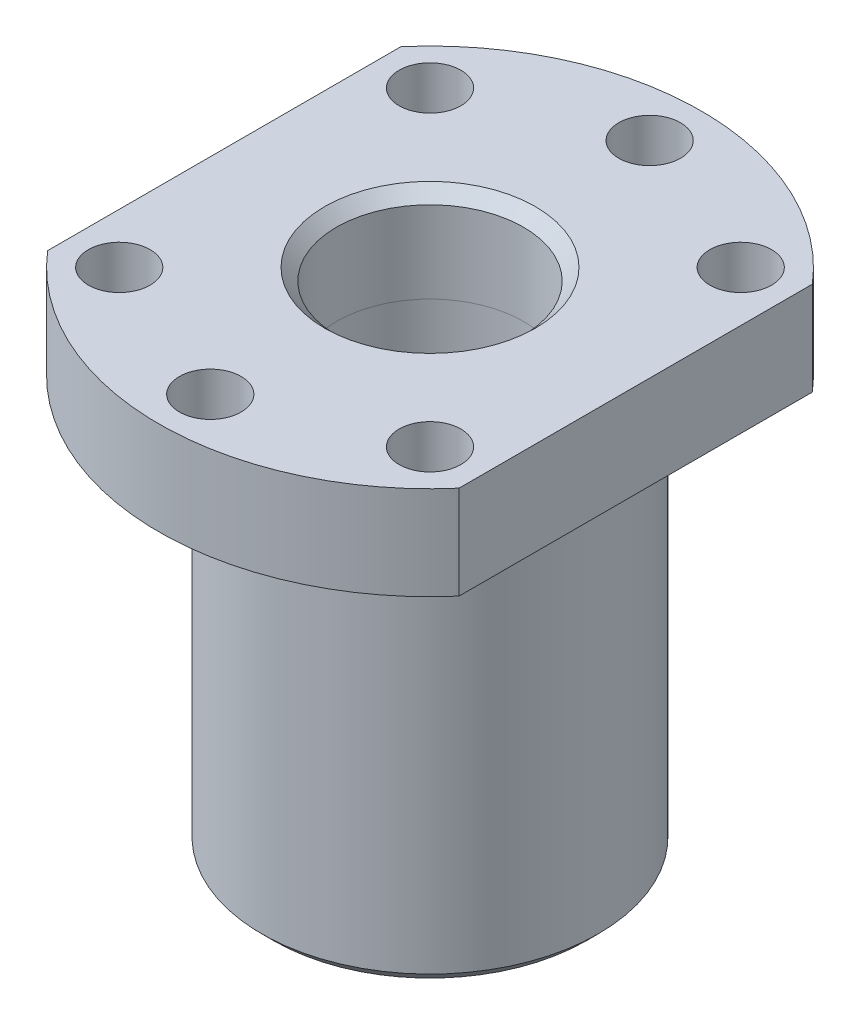
ISO-10303-21;
HEADER;
FILE_DESCRIPTION(('STEP AP214'),'2;1');
FILE_NAME('part.step','',(''),(''),'','','');
FILE_SCHEMA(('AUTOMOTIVE_DESIGN { 1 0 10303 214 1 1 1 1 }'));
ENDSEC;
DATA;
#1=APPLICATION_CONTEXT('core data for automotive mechanical design processes');
#2=APPLICATION_PROTOCOL_DEFINITION('international standard','automotive_design',2000,#1);
#3=PRODUCT_CONTEXT('',#1,'mechanical');
#4=PRODUCT('Part','Part','',(#3));
#5=PRODUCT_RELATED_PRODUCT_CATEGORY('part','',(#4));
#6=PRODUCT_DEFINITION_FORMATION('','',#4);
#7=PRODUCT_DEFINITION_CONTEXT('part definition',#1,'design');
#8=PRODUCT_DEFINITION('design','',#6,#7);
#9=PRODUCT_DEFINITION_SHAPE('','',#8);
#10=(LENGTH_UNIT() NAMED_UNIT(*) SI_UNIT(.MILLI.,.METRE.));
#11=(NAMED_UNIT(*) PLANE_ANGLE_UNIT() SI_UNIT($,.RADIAN.));
#12=(NAMED_UNIT(*) SI_UNIT($,.STERADIAN.) SOLID_ANGLE_UNIT());
#13=UNCERTAINTY_MEASURE_WITH_UNIT(LENGTH_MEASURE(1.E-05),#10,'distance_accuracy_value','');
#14=(GEOMETRIC_REPRESENTATION_CONTEXT(3) GLOBAL_UNCERTAINTY_ASSIGNED_CONTEXT((#13)) GLOBAL_UNIT_ASSIGNED_CONTEXT((#10,
#11,#12)) REPRESENTATION_CONTEXT('',''));
#15=CARTESIAN_POINT('',(0.,0.,0.));
#16=DIRECTION('',(0.,0.,1.));
#17=DIRECTION('',(1.,0.,0.));
#18=AXIS2_PLACEMENT_3D('',#15,#16,#17);
#19=CARTESIAN_POINT('',(0.,0.,0.));
#20=DIRECTION('',(0.,1.,0.));
#21=DIRECTION('',(1.,0.,0.));
#22=AXIS2_PLACEMENT_3D('',#19,#20,#21);
#23=PLANE('',#22);
#24=CARTESIAN_POINT('',(16.6170093578839,0.,16.6170093578839));
#25=DIRECTION('',(0.,-1.,0.));
#26=DIRECTION('',(1.,0.,0.));
#27=AXIS2_PLACEMENT_3D('',#24,#25,#26);
#28=CIRCLE('',#27,3.3);
#29=CARTESIAN_POINT('',(13.3170093578839,0.,16.6170093578839));
#30=VERTEX_POINT('',#29);
#31=EDGE_CURVE('P0_E194',#30,#30,#28,.T.);
#32=ORIENTED_EDGE('',*,*,#31,.F.);
#33=EDGE_LOOP('',(#32));
#34=FACE_BOUND('',#33,.T.);
#35=CARTESIAN_POINT('',(-16.6170093578839,0.,16.6170093578839));
#36=DIRECTION('',(0.,-1.,0.));
#37=DIRECTION('',(1.,0.,0.));
#38=AXIS2_PLACEMENT_3D('',#35,#36,#37);
#39=CIRCLE('',#38,3.3);
#40=CARTESIAN_POINT('',(-19.9170093578839,0.,16.6170093578839));
#41=VERTEX_POINT('',#40);
#42=EDGE_CURVE('P0_E205',#41,#41,#39,.T.);
#43=ORIENTED_EDGE('',*,*,#42,.F.);
#44=EDGE_LOOP('',(#43));
#45=FACE_BOUND('',#44,.T.);
#46=CARTESIAN_POINT('',(0.,0.,0.));
#47=DIRECTION('',(0.,-1.,0.));
#48=DIRECTION('',(1.,0.,0.));
#49=AXIS2_PLACEMENT_3D('',#46,#47,#48);
#50=CIRCLE('',#49,10.);
#51=CARTESIAN_POINT('',(-10.,0.,0.));
#52=VERTEX_POINT('',#51);
#53=EDGE_CURVE('P0_E156',#52,#52,#50,.T.);
#54=ORIENTED_EDGE('',*,*,#53,.F.);
#55=EDGE_LOOP('',(#54));
#56=FACE_BOUND('',#55,.T.);
#57=CARTESIAN_POINT('',(16.6170093578839,0.,-16.6170093578839));
#58=DIRECTION('',(0.,-1.,0.));
#59=DIRECTION('',(1.,0.,0.));
#60=AXIS2_PLACEMENT_3D('',#57,#58,#59);
#61=CIRCLE('',#60,3.3);
#62=CARTESIAN_POINT('',(13.3170093578839,0.,-16.6170093578839));
#63=VERTEX_POINT('',#62);
#64=EDGE_CURVE('P0_E207',#63,#63,#61,.T.);
#65=ORIENTED_EDGE('',*,*,#64,.F.);
#66=EDGE_LOOP('',(#65));
#67=FACE_BOUND('',#66,.T.);
#68=CARTESIAN_POINT('',(-16.6170093578839,0.,-16.6170093578839));
#69=DIRECTION('',(0.,-1.,0.));
#70=DIRECTION('',(1.,0.,0.));
#71=AXIS2_PLACEMENT_3D('',#68,#69,#70);
#72=CIRCLE('',#71,3.3);
#73=CARTESIAN_POINT('',(-19.9170093578839,0.,-16.6170093578839));
#74=VERTEX_POINT('',#73);
#75=EDGE_CURVE('P0_E216',#74,#74,#72,.T.);
#76=ORIENTED_EDGE('',*,*,#75,.F.);
#77=EDGE_LOOP('',(#76));
#78=FACE_BOUND('',#77,.T.);
#79=CARTESIAN_POINT('',(0.,0.,23.5));
#80=DIRECTION('',(0.,-1.,0.));
#81=DIRECTION('',(1.,0.,0.));
#82=AXIS2_PLACEMENT_3D('',#79,#80,#81);
#83=CIRCLE('',#82,3.3);
#84=CARTESIAN_POINT('',(-3.3,0.,23.5));
#85=VERTEX_POINT('',#84);
#86=EDGE_CURVE('P0_E225',#85,#85,#83,.T.);
#87=ORIENTED_EDGE('',*,*,#86,.F.);
#88=EDGE_LOOP('',(#87));
#89=FACE_BOUND('',#88,.T.);
#90=CARTESIAN_POINT('',(-0.00892580224964604,0.,-23.4999983048947));
#91=DIRECTION('',(0.,-1.,0.));
#92=DIRECTION('',(1.,0.,0.));
#93=AXIS2_PLACEMENT_3D('',#90,#91,#92);
#94=CIRCLE('',#93,3.3);
#95=CARTESIAN_POINT('',(-3.30892580224965,0.,-23.4999983048947));
#96=VERTEX_POINT('',#95);
#97=EDGE_CURVE('P0_E121',#96,#96,#94,.T.);
#98=ORIENTED_EDGE('',*,*,#97,.F.);
#99=EDGE_LOOP('',(#98));
#100=FACE_BOUND('',#99,.T.);
#101=CARTESIAN_POINT('',(0.,0.,0.));
#102=DIRECTION('',(0.,1.,0.));
#103=DIRECTION('',(1.,0.,0.));
#104=AXIS2_PLACEMENT_3D('',#101,#102,#103);
#105=CIRCLE('',#104,29.);
#106=CARTESIAN_POINT('',(-22.,0.,18.8944436276912));
#107=VERTEX_POINT('',#106);
#108=CARTESIAN_POINT('',(22.,0.,18.8944436276912));
#109=VERTEX_POINT('',#108);
#110=EDGE_CURVE('P0_E11',#107,#109,#105,.T.);
#111=ORIENTED_EDGE('',*,*,#110,.F.);
#112=DIRECTION('',(0.,0.,-1.));
#113=VECTOR('',#112,1.);
#114=CARTESIAN_POINT('',(-22.,0.,18.8944436276912));
#115=LINE('',#114,#113);
#116=CARTESIAN_POINT('',(-22.,0.,-18.8944436276912));
#117=VERTEX_POINT('',#116);
#118=EDGE_CURVE('P0_E102',#107,#117,#115,.T.);
#119=ORIENTED_EDGE('',*,*,#118,.T.);
#120=CARTESIAN_POINT('',(0.,0.,0.));
#121=DIRECTION('',(0.,1.,0.));
#122=DIRECTION('',(1.,0.,0.));
#123=AXIS2_PLACEMENT_3D('',#120,#121,#122);
#124=CIRCLE('',#123,29.);
#125=CARTESIAN_POINT('',(22.,0.,-18.8944436276912));
#126=VERTEX_POINT('',#125);
#127=EDGE_CURVE('P0_E131',#126,#117,#124,.T.);
#128=ORIENTED_EDGE('',*,*,#127,.F.);
#129=DIRECTION('',(0.,0.,1.));
#130=VECTOR('',#129,1.);
#131=CARTESIAN_POINT('',(22.,0.,-18.8944436276912));
#132=LINE('',#131,#130);
#133=EDGE_CURVE('P0_E47',#126,#109,#132,.T.);
#134=ORIENTED_EDGE('',*,*,#133,.T.);
#135=EDGE_LOOP('',(#111,#119,#128,#134));
#136=FACE_BOUND('',#135,.T.);
#137=ADVANCED_FACE('P0_F17',(#34,#45,#56,#67,#78,#89,#100,#136),#23,.F.);
#138=CARTESIAN_POINT('',(0.,0.,0.));
#139=DIRECTION('',(0.,1.,0.));
#140=DIRECTION('',(1.,0.,0.));
#141=AXIS2_PLACEMENT_3D('',#138,#139,#140);
#142=CYLINDRICAL_SURFACE('',#141,29.);
#143=ORIENTED_EDGE('',*,*,#110,.T.);
#144=DIRECTION('',(0.,1.,0.));
#145=VECTOR('',#144,1.);
#146=CARTESIAN_POINT('',(22.,0.,18.8944436276912));
#147=LINE('',#146,#145);
#148=CARTESIAN_POINT('',(22.,10.,18.8944436276912));
#149=VERTEX_POINT('',#148);
#150=EDGE_CURVE('P0_E21',#109,#149,#147,.T.);
#151=ORIENTED_EDGE('',*,*,#150,.T.);
#152=CARTESIAN_POINT('',(0.,10.,0.));
#153=DIRECTION('',(0.,1.,0.));
#154=DIRECTION('',(1.,0.,0.));
#155=AXIS2_PLACEMENT_3D('',#152,#153,#154);
#156=CIRCLE('',#155,29.);
#157=CARTESIAN_POINT('',(-22.,10.,18.8944436276912));
#158=VERTEX_POINT('',#157);
#159=EDGE_CURVE('P0_E112',#158,#149,#156,.T.);
#160=ORIENTED_EDGE('',*,*,#159,.F.);
#161=DIRECTION('',(0.,1.,0.));
#162=VECTOR('',#161,1.);
#163=CARTESIAN_POINT('',(-22.,0.,18.8944436276912));
#164=LINE('',#163,#162);
#165=EDGE_CURVE('P0_E110',#107,#158,#164,.T.);
#166=ORIENTED_EDGE('',*,*,#165,.F.);
#167=EDGE_LOOP('',(#143,#151,#160,#166));
#168=FACE_BOUND('',#167,.T.);
#169=ADVANCED_FACE('P0_F107',(#168),#142,.T.);
#170=CARTESIAN_POINT('',(22.,0.,18.8944436276912));
#171=DIRECTION('',(1.,0.,0.));
#172=DIRECTION('',(0.,1.,0.));
#173=AXIS2_PLACEMENT_3D('',#170,#171,#172);
#174=PLANE('',#173);
#175=ORIENTED_EDGE('',*,*,#133,.F.);
#176=DIRECTION('',(0.,1.,0.));
#177=VECTOR('',#176,1.);
#178=CARTESIAN_POINT('',(22.,0.,-18.8944436276912));
#179=LINE('',#178,#177);
#180=CARTESIAN_POINT('',(22.,10.,-18.8944436276912));
#181=VERTEX_POINT('',#180);
#182=EDGE_CURVE('P0_E133',#126,#181,#179,.T.);
#183=ORIENTED_EDGE('',*,*,#182,.T.);
#184=DIRECTION('',(0.,0.,-1.));
#185=VECTOR('',#184,1.);
#186=CARTESIAN_POINT('',(22.,10.,-18.8944436276912));
#187=LINE('',#186,#185);
#188=EDGE_CURVE('P0_E148',#149,#181,#187,.T.);
#189=ORIENTED_EDGE('',*,*,#188,.F.);
#190=ORIENTED_EDGE('',*,*,#150,.F.);
#191=EDGE_LOOP('',(#175,#183,#189,#190));
#192=FACE_BOUND('',#191,.T.);
#193=ADVANCED_FACE('P0_F19',(#192),#174,.T.);
#194=CARTESIAN_POINT('',(0.,0.,0.));
#195=DIRECTION('',(0.,1.,0.));
#196=DIRECTION('',(1.,0.,0.));
#197=AXIS2_PLACEMENT_3D('',#194,#195,#196);
#198=CYLINDRICAL_SURFACE('',#197,29.);
#199=ORIENTED_EDGE('',*,*,#127,.T.);
#200=DIRECTION('',(0.,1.,0.));
#201=VECTOR('',#200,1.);
#202=CARTESIAN_POINT('',(-22.,0.,-18.8944436276912));
#203=LINE('',#202,#201);
#204=CARTESIAN_POINT('',(-22.,10.,-18.8944436276912));
#205=VERTEX_POINT('',#204);
#206=EDGE_CURVE('P0_E116',#117,#205,#203,.T.);
#207=ORIENTED_EDGE('',*,*,#206,.T.);
#208=CARTESIAN_POINT('',(0.,10.,0.));
#209=DIRECTION('',(0.,1.,0.));
#210=DIRECTION('',(1.,0.,0.));
#211=AXIS2_PLACEMENT_3D('',#208,#209,#210);
#212=CIRCLE('',#211,29.);
#213=EDGE_CURVE('P0_E151',#181,#205,#212,.T.);
#214=ORIENTED_EDGE('',*,*,#213,.F.);
#215=ORIENTED_EDGE('',*,*,#182,.F.);
#216=EDGE_LOOP('',(#199,#207,#214,#215));
#217=FACE_BOUND('',#216,.T.);
#218=ADVANCED_FACE('P0_F335',(#217),#198,.T.);
#219=CARTESIAN_POINT('',(-22.,0.,-18.8944436276912));
#220=DIRECTION('',(-1.,0.,0.));
#221=DIRECTION('',(0.,1.,0.));
#222=AXIS2_PLACEMENT_3D('',#219,#220,#221);
#223=PLANE('',#222);
#224=ORIENTED_EDGE('',*,*,#118,.F.);
#225=ORIENTED_EDGE('',*,*,#165,.T.);
#226=DIRECTION('',(0.,0.,1.));
#227=VECTOR('',#226,1.);
#228=CARTESIAN_POINT('',(-22.,10.,18.8944436276912));
#229=LINE('',#228,#227);
#230=EDGE_CURVE('P0_E152',#205,#158,#229,.T.);
#231=ORIENTED_EDGE('',*,*,#230,.F.);
#232=ORIENTED_EDGE('',*,*,#206,.F.);
#233=EDGE_LOOP('',(#224,#225,#231,#232));
#234=FACE_BOUND('',#233,.T.);
#235=ADVANCED_FACE('P0_F118',(#234),#223,.T.);
#236=CARTESIAN_POINT('',(-0.00892580224964604,0.,-23.4999983048947));
#237=DIRECTION('',(0.,1.,0.));
#238=DIRECTION('',(1.,0.,0.));
#239=AXIS2_PLACEMENT_3D('',#236,#237,#238);
#240=CYLINDRICAL_SURFACE('',#239,3.3);
#241=CARTESIAN_POINT('',(-0.00892580224964604,10.,-23.4999983048947));
#242=DIRECTION('',(0.,-1.,0.));
#243=DIRECTION('',(1.,0.,0.));
#244=AXIS2_PLACEMENT_3D('',#241,#242,#243);
#245=CIRCLE('',#244,3.3);
#246=CARTESIAN_POINT('',(-3.30892580224965,10.,-23.4999983048947));
#247=VERTEX_POINT('',#246);
#248=EDGE_CURVE('P0_E182',#247,#247,#245,.T.);
#249=ORIENTED_EDGE('',*,*,#248,.F.);
#250=DIRECTION('',(0.,-1.,0.));
#251=VECTOR('',#250,1.);
#252=CARTESIAN_POINT('',(-3.30892580224965,0.,-23.4999983048947));
#253=LINE('',#252,#251);
#254=EDGE_CURVE('P0_E126',#247,#96,#253,.T.);
#255=ORIENTED_EDGE('',*,*,#254,.T.);
#256=ORIENTED_EDGE('',*,*,#97,.T.);
#257=ORIENTED_EDGE('',*,*,#254,.F.);
#258=EDGE_LOOP('',(#249,#255,#256,#257));
#259=FACE_BOUND('',#258,.T.);
#260=ADVANCED_FACE('P0_F231',(#259),#240,.F.);
#261=CARTESIAN_POINT('',(0.,0.,23.5));
#262=DIRECTION('',(0.,1.,0.));
#263=DIRECTION('',(1.,0.,0.));
#264=AXIS2_PLACEMENT_3D('',#261,#262,#263);
#265=CYLINDRICAL_SURFACE('',#264,3.3);
#266=CARTESIAN_POINT('',(0.,10.,23.5));
#267=DIRECTION('',(0.,-1.,0.));
#268=DIRECTION('',(1.,0.,0.));
#269=AXIS2_PLACEMENT_3D('',#266,#267,#268);
#270=CIRCLE('',#269,3.3);
#271=CARTESIAN_POINT('',(-3.3,10.,23.5));
#272=VERTEX_POINT('',#271);
#273=EDGE_CURVE('P0_E183',#272,#272,#270,.T.);
#274=ORIENTED_EDGE('',*,*,#273,.F.);
#275=DIRECTION('',(0.,-1.,0.));
#276=VECTOR('',#275,1.);
#277=CARTESIAN_POINT('',(-3.3,0.,23.5));
#278=LINE('',#277,#276);
#279=EDGE_CURVE('P0_E218',#272,#85,#278,.T.);
#280=ORIENTED_EDGE('',*,*,#279,.T.);
#281=ORIENTED_EDGE('',*,*,#86,.T.);
#282=ORIENTED_EDGE('',*,*,#279,.F.);
#283=EDGE_LOOP('',(#274,#280,#281,#282));
#284=FACE_BOUND('',#283,.T.);
#285=ADVANCED_FACE('P0_F269',(#284),#265,.F.);
#286=CARTESIAN_POINT('',(-16.6170093578839,0.,-16.6170093578839));
#287=DIRECTION('',(0.,1.,0.));
#288=DIRECTION('',(1.,0.,0.));
#289=AXIS2_PLACEMENT_3D('',#286,#287,#288);
#290=CYLINDRICAL_SURFACE('',#289,3.3);
#291=CARTESIAN_POINT('',(-16.6170093578839,10.,-16.6170093578839));
#292=DIRECTION('',(0.,-1.,0.));
#293=DIRECTION('',(1.,0.,0.));
#294=AXIS2_PLACEMENT_3D('',#291,#292,#293);
#295=CIRCLE('',#294,3.3);
#296=CARTESIAN_POINT('',(-19.9170093578839,10.,-16.6170093578839));
#297=VERTEX_POINT('',#296);
#298=EDGE_CURVE('P0_E177',#297,#297,#295,.T.);
#299=ORIENTED_EDGE('',*,*,#298,.F.);
#300=DIRECTION('',(0.,-1.,0.));
#301=VECTOR('',#300,1.);
#302=CARTESIAN_POINT('',(-19.9170093578839,0.,-16.6170093578839));
#303=LINE('',#302,#301);
#304=EDGE_CURVE('P0_E215',#297,#74,#303,.T.);
#305=ORIENTED_EDGE('',*,*,#304,.T.);
#306=ORIENTED_EDGE('',*,*,#75,.T.);
#307=ORIENTED_EDGE('',*,*,#304,.F.);
#308=EDGE_LOOP('',(#299,#305,#306,#307));
#309=FACE_BOUND('',#308,.T.);
#310=ADVANCED_FACE('P0_F345',(#309),#290,.F.);
#311=CARTESIAN_POINT('',(16.6170093578839,0.,-16.6170093578839));
#312=DIRECTION('',(0.,1.,0.));
#313=DIRECTION('',(1.,0.,0.));
#314=AXIS2_PLACEMENT_3D('',#311,#312,#313);
#315=CYLINDRICAL_SURFACE('',#314,3.3);
#316=CARTESIAN_POINT('',(16.6170093578839,10.,-16.6170093578839));
#317=DIRECTION('',(0.,-1.,0.));
#318=DIRECTION('',(1.,0.,0.));
#319=AXIS2_PLACEMENT_3D('',#316,#317,#318);
#320=CIRCLE('',#319,3.3);
#321=CARTESIAN_POINT('',(13.3170093578839,10.,-16.6170093578839));
#322=VERTEX_POINT('',#321);
#323=EDGE_CURVE('P0_E175',#322,#322,#320,.T.);
#324=ORIENTED_EDGE('',*,*,#323,.F.);
#325=DIRECTION('',(0.,-1.,0.));
#326=VECTOR('',#325,1.);
#327=CARTESIAN_POINT('',(13.3170093578839,0.,-16.6170093578839));
#328=LINE('',#327,#326);
#329=EDGE_CURVE('P0_E202',#322,#63,#328,.T.);
#330=ORIENTED_EDGE('',*,*,#329,.T.);
#331=ORIENTED_EDGE('',*,*,#64,.T.);
#332=ORIENTED_EDGE('',*,*,#329,.F.);
#333=EDGE_LOOP('',(#324,#330,#331,#332));
#334=FACE_BOUND('',#333,.T.);
#335=ADVANCED_FACE('P0_F329',(#334),#315,.F.);
#336=CARTESIAN_POINT('',(-16.6170093578839,0.,16.6170093578839));
#337=DIRECTION('',(0.,1.,0.));
#338=DIRECTION('',(1.,0.,0.));
#339=AXIS2_PLACEMENT_3D('',#336,#337,#338);
#340=CYLINDRICAL_SURFACE('',#339,3.3);
#341=CARTESIAN_POINT('',(-16.6170093578839,10.,16.6170093578839));
#342=DIRECTION('',(0.,-1.,0.));
#343=DIRECTION('',(1.,0.,0.));
#344=AXIS2_PLACEMENT_3D('',#341,#342,#343);
#345=CIRCLE('',#344,3.3);
#346=CARTESIAN_POINT('',(-19.9170093578839,10.,16.6170093578839));
#347=VERTEX_POINT('',#346);
#348=EDGE_CURVE('P0_E171',#347,#347,#345,.T.);
#349=ORIENTED_EDGE('',*,*,#348,.F.);
#350=DIRECTION('',(0.,-1.,0.));
#351=VECTOR('',#350,1.);
#352=CARTESIAN_POINT('',(-19.9170093578839,0.,16.6170093578839));
#353=LINE('',#352,#351);
#354=EDGE_CURVE('P0_E196',#347,#41,#353,.T.);
#355=ORIENTED_EDGE('',*,*,#354,.T.);
#356=ORIENTED_EDGE('',*,*,#42,.T.);
#357=ORIENTED_EDGE('',*,*,#354,.F.);
#358=EDGE_LOOP('',(#349,#355,#356,#357));
#359=FACE_BOUND('',#358,.T.);
#360=ADVANCED_FACE('P0_F331',(#359),#340,.F.);
#361=CARTESIAN_POINT('',(16.6170093578839,0.,16.6170093578839));
#362=DIRECTION('',(0.,1.,0.));
#363=DIRECTION('',(1.,0.,0.));
#364=AXIS2_PLACEMENT_3D('',#361,#362,#363);
#365=CYLINDRICAL_SURFACE('',#364,3.3);
#366=CARTESIAN_POINT('',(16.6170093578839,10.,16.6170093578839));
#367=DIRECTION('',(0.,-1.,0.));
#368=DIRECTION('',(1.,0.,0.));
#369=AXIS2_PLACEMENT_3D('',#366,#367,#368);
#370=CIRCLE('',#369,3.3);
#371=CARTESIAN_POINT('',(13.3170093578839,10.,16.6170093578839));
#372=VERTEX_POINT('',#371);
#373=EDGE_CURVE('P0_E170',#372,#372,#370,.T.);
#374=ORIENTED_EDGE('',*,*,#373,.F.);
#375=DIRECTION('',(0.,-1.,0.));
#376=VECTOR('',#375,1.);
#377=CARTESIAN_POINT('',(13.3170093578839,0.,16.6170093578839));
#378=LINE('',#377,#376);
#379=EDGE_CURVE('P0_E187',#372,#30,#378,.T.);
#380=ORIENTED_EDGE('',*,*,#379,.T.);
#381=ORIENTED_EDGE('',*,*,#31,.T.);
#382=ORIENTED_EDGE('',*,*,#379,.F.);
#383=EDGE_LOOP('',(#374,#380,#381,#382));
#384=FACE_BOUND('',#383,.T.);
#385=ADVANCED_FACE('P0_F236',(#384),#365,.F.);
#386=CARTESIAN_POINT('',(0.,10.,0.));
#387=DIRECTION('',(0.,1.,0.));
#388=DIRECTION('',(1.,0.,0.));
#389=AXIS2_PLACEMENT_3D('',#386,#387,#388);
#390=PLANE('',#389);
#391=CARTESIAN_POINT('',(0.,10.,0.));
#392=DIRECTION('',(0.,1.,0.));
#393=DIRECTION('',(1.,0.,0.));
#394=AXIS2_PLACEMENT_3D('',#391,#392,#393);
#395=CIRCLE('',#394,11.27);
#396=CARTESIAN_POINT('',(-11.27,10.,0.));
#397=VERTEX_POINT('',#396);
#398=EDGE_CURVE('P0_E303',#397,#397,#395,.T.);
#399=ORIENTED_EDGE('',*,*,#398,.F.);
#400=EDGE_LOOP('',(#399));
#401=FACE_BOUND('',#400,.T.);
#402=ORIENTED_EDGE('',*,*,#248,.T.);
#403=EDGE_LOOP('',(#402));
#404=FACE_BOUND('',#403,.T.);
#405=ORIENTED_EDGE('',*,*,#273,.T.);
#406=EDGE_LOOP('',(#405));
#407=FACE_BOUND('',#406,.T.);
#408=ORIENTED_EDGE('',*,*,#298,.T.);
#409=EDGE_LOOP('',(#408));
#410=FACE_BOUND('',#409,.T.);
#411=ORIENTED_EDGE('',*,*,#323,.T.);
#412=EDGE_LOOP('',(#411));
#413=FACE_BOUND('',#412,.T.);
#414=ORIENTED_EDGE('',*,*,#348,.T.);
#415=EDGE_LOOP('',(#414));
#416=FACE_BOUND('',#415,.T.);
#417=ORIENTED_EDGE('',*,*,#373,.T.);
#418=EDGE_LOOP('',(#417));
#419=FACE_BOUND('',#418,.T.);
#420=ORIENTED_EDGE('',*,*,#159,.T.);
#421=ORIENTED_EDGE('',*,*,#188,.T.);
#422=ORIENTED_EDGE('',*,*,#213,.T.);
#423=ORIENTED_EDGE('',*,*,#230,.T.);
#424=EDGE_LOOP('',(#420,#421,#422,#423));
#425=FACE_BOUND('',#424,.T.);
#426=ADVANCED_FACE('P0_F153',(#401,#404,#407,#410,#413,#416,#419,#425),#390,.T.);
#427=CARTESIAN_POINT('',(0.,0.,0.));
#428=DIRECTION('',(0.,1.,0.));
#429=DIRECTION('',(1.,0.,0.));
#430=AXIS2_PLACEMENT_3D('',#427,#428,#429);
#431=CYLINDRICAL_SURFACE('',#430,10.);
#432=CARTESIAN_POINT('',(0.,8.73,0.));
#433=DIRECTION('',(0.,-1.,0.));
#434=DIRECTION('',(1.,0.,0.));
#435=AXIS2_PLACEMENT_3D('',#432,#433,#434);
#436=CIRCLE('',#435,10.);
#437=CARTESIAN_POINT('',(-10.,8.73,0.));
#438=VERTEX_POINT('',#437);
#439=EDGE_CURVE('P0_E304',#438,#438,#436,.T.);
#440=ORIENTED_EDGE('',*,*,#439,.F.);
#441=DIRECTION('',(0.,-1.,0.));
#442=VECTOR('',#441,1.);
#443=CARTESIAN_POINT('',(-10.,0.,0.));
#444=LINE('',#443,#442);
#445=EDGE_CURVE('P0_E165',#438,#52,#444,.T.);
#446=ORIENTED_EDGE('',*,*,#445,.T.);
#447=ORIENTED_EDGE('',*,*,#53,.T.);
#448=ORIENTED_EDGE('',*,*,#445,.F.);
#449=EDGE_LOOP('',(#440,#446,#447,#448));
#450=FACE_BOUND('',#449,.T.);
#451=ADVANCED_FACE('P0_F240',(#450),#431,.F.);
#452=CARTESIAN_POINT('',(0.,9.365,0.));
#453=DIRECTION('',(0.,1.,0.));
#454=DIRECTION('',(1.,0.,0.));
#455=AXIS2_PLACEMENT_3D('',#452,#453,#454);
#456=CONICAL_SURFACE('',#455,10.635,0.785398163397448);
#457=ORIENTED_EDGE('',*,*,#398,.T.);
#458=DIRECTION('',(0.707106781186548,-0.707106781186548,0.));
#459=VECTOR('',#458,1.);
#460=CARTESIAN_POINT('',(-10.635,9.365,0.));
#461=LINE('',#460,#459);
#462=EDGE_CURVE('P0_E299',#397,#438,#461,.T.);
#463=ORIENTED_EDGE('',*,*,#462,.T.);
#464=ORIENTED_EDGE('',*,*,#439,.T.);
#465=ORIENTED_EDGE('',*,*,#462,.F.);
#466=EDGE_LOOP('',(#457,#463,#464,#465));
#467=FACE_BOUND('',#466,.T.);
#468=ADVANCED_FACE('P0_F301',(#467),#456,.F.);
#469=CLOSED_SHELL('',(#137,#169,#193,#218,#235,#260,#285,#310,#335,#360,#385,#426,#451,#468));
#470=MANIFOLD_SOLID_BREP('P0_B1',#469);
#471=CARTESIAN_POINT('',(0.,0.,0.));
#472=DIRECTION('',(0.,1.,0.));
#473=DIRECTION('',(1.,0.,0.));
#474=AXIS2_PLACEMENT_3D('',#471,#472,#473);
#475=PLANE('',#474);
#476=CARTESIAN_POINT('',(0.,0.,0.));
#477=DIRECTION('',(0.,-1.,0.));
#478=DIRECTION('',(1.,0.,0.));
#479=AXIS2_PLACEMENT_3D('',#476,#477,#478);
#480=CIRCLE('',#479,10.);
#481=CARTESIAN_POINT('',(-10.,0.,0.));
#482=VERTEX_POINT('',#481);
#483=EDGE_CURVE('P1_E11',#482,#482,#480,.T.);
#484=ORIENTED_EDGE('',*,*,#483,.T.);
#485=EDGE_LOOP('',(#484));
#486=FACE_BOUND('',#485,.T.);
#487=CARTESIAN_POINT('',(0.,0.,0.));
#488=DIRECTION('',(0.,1.,0.));
#489=DIRECTION('',(1.,0.,0.));
#490=AXIS2_PLACEMENT_3D('',#487,#488,#489);
#491=CIRCLE('',#490,18.);
#492=CARTESIAN_POINT('',(-18.,0.,0.));
#493=VERTEX_POINT('',#492);
#494=EDGE_CURVE('P1_E87',#493,#493,#491,.T.);
#495=ORIENTED_EDGE('',*,*,#494,.T.);
#496=EDGE_LOOP('',(#495));
#497=FACE_BOUND('',#496,.T.);
#498=ADVANCED_FACE('P1_F18',(#486,#497),#475,.T.);
#499=CARTESIAN_POINT('',(0.,0.,0.));
#500=DIRECTION('',(0.,-1.,0.));
#501=DIRECTION('',(1.,0.,0.));
#502=AXIS2_PLACEMENT_3D('',#499,#500,#501);
#503=CYLINDRICAL_SURFACE('',#502,10.);
#504=CARTESIAN_POINT('',(0.,-42.73,0.));
#505=DIRECTION('',(0.,1.,0.));
#506=DIRECTION('',(1.,0.,0.));
#507=AXIS2_PLACEMENT_3D('',#504,#505,#506);
#508=CIRCLE('',#507,10.);
#509=CARTESIAN_POINT('',(-10.,-42.73,0.));
#510=VERTEX_POINT('',#509);
#511=EDGE_CURVE('P1_E21',#510,#510,#508,.T.);
#512=ORIENTED_EDGE('',*,*,#511,.F.);
#513=DIRECTION('',(0.,1.,0.));
#514=VECTOR('',#513,1.);
#515=CARTESIAN_POINT('',(-10.,0.,0.));
#516=LINE('',#515,#514);
#517=EDGE_CURVE('P1_E30',#510,#482,#516,.T.);
#518=ORIENTED_EDGE('',*,*,#517,.T.);
#519=ORIENTED_EDGE('',*,*,#483,.F.);
#520=ORIENTED_EDGE('',*,*,#517,.F.);
#521=EDGE_LOOP('',(#512,#518,#519,#520));
#522=FACE_BOUND('',#521,.T.);
#523=ADVANCED_FACE('P1_F99',(#522),#503,.F.);
#524=CARTESIAN_POINT('',(0.,-43.365,0.));
#525=DIRECTION('',(0.,-1.,0.));
#526=DIRECTION('',(1.,0.,0.));
#527=AXIS2_PLACEMENT_3D('',#524,#525,#526);
#528=CONICAL_SURFACE('',#527,10.635,0.785398163397449);
#529=CARTESIAN_POINT('',(0.,-44.,0.));
#530=DIRECTION('',(0.,-1.,0.));
#531=DIRECTION('',(1.,0.,0.));
#532=AXIS2_PLACEMENT_3D('',#529,#530,#531);
#533=CIRCLE('',#532,11.27);
#534=CARTESIAN_POINT('',(-11.27,-44.,0.));
#535=VERTEX_POINT('',#534);
#536=EDGE_CURVE('P1_E80',#535,#535,#533,.T.);
#537=ORIENTED_EDGE('',*,*,#536,.T.);
#538=DIRECTION('',(0.707106781186548,0.707106781186547,0.));
#539=VECTOR('',#538,1.);
#540=CARTESIAN_POINT('',(-10.635,-43.365,0.));
#541=LINE('',#540,#539);
#542=EDGE_CURVE('P1_E89',#535,#510,#541,.T.);
#543=ORIENTED_EDGE('',*,*,#542,.T.);
#544=ORIENTED_EDGE('',*,*,#511,.T.);
#545=ORIENTED_EDGE('',*,*,#542,.F.);
#546=EDGE_LOOP('',(#537,#543,#544,#545));
#547=FACE_BOUND('',#546,.T.);
#548=ADVANCED_FACE('P1_F97',(#547),#528,.F.);
#549=CARTESIAN_POINT('',(0.,0.,0.));
#550=DIRECTION('',(0.,-1.,0.));
#551=DIRECTION('',(1.,0.,0.));
#552=AXIS2_PLACEMENT_3D('',#549,#550,#551);
#553=CYLINDRICAL_SURFACE('',#552,18.);
#554=CARTESIAN_POINT('',(0.,-42.73,0.));
#555=DIRECTION('',(0.,-1.,0.));
#556=DIRECTION('',(1.,0.,0.));
#557=AXIS2_PLACEMENT_3D('',#554,#555,#556);
#558=CIRCLE('',#557,18.);
#559=CARTESIAN_POINT('',(-18.,-42.73,0.));
#560=VERTEX_POINT('',#559);
#561=EDGE_CURVE('P1_E69',#560,#560,#558,.T.);
#562=ORIENTED_EDGE('',*,*,#561,.F.);
#563=DIRECTION('',(0.,1.,0.));
#564=VECTOR('',#563,1.);
#565=CARTESIAN_POINT('',(-18.,0.,0.));
#566=LINE('',#565,#564);
#567=EDGE_CURVE('P1_E88',#560,#493,#566,.T.);
#568=ORIENTED_EDGE('',*,*,#567,.T.);
#569=ORIENTED_EDGE('',*,*,#494,.F.);
#570=ORIENTED_EDGE('',*,*,#567,.F.);
#571=EDGE_LOOP('',(#562,#568,#569,#570));
#572=FACE_BOUND('',#571,.T.);
#573=ADVANCED_FACE('P1_F107',(#572),#553,.T.);
#574=CARTESIAN_POINT('',(0.,-44.,0.));
#575=DIRECTION('',(0.,1.,0.));
#576=DIRECTION('',(1.,0.,0.));
#577=AXIS2_PLACEMENT_3D('',#574,#575,#576);
#578=PLANE('',#577);
#579=ORIENTED_EDGE('',*,*,#536,.F.);
#580=EDGE_LOOP('',(#579));
#581=FACE_BOUND('',#580,.T.);
#582=CARTESIAN_POINT('',(0.,-44.,0.));
#583=DIRECTION('',(0.,1.,0.));
#584=DIRECTION('',(1.,0.,0.));
#585=AXIS2_PLACEMENT_3D('',#582,#583,#584);
#586=CIRCLE('',#585,16.73);
#587=CARTESIAN_POINT('',(-16.73,-44.,0.));
#588=VERTEX_POINT('',#587);
#589=EDGE_CURVE('P1_E68',#588,#588,#586,.T.);
#590=ORIENTED_EDGE('',*,*,#589,.F.);
#591=EDGE_LOOP('',(#590));
#592=FACE_BOUND('',#591,.T.);
#593=ADVANCED_FACE('P1_F114',(#581,#592),#578,.F.);
#594=CARTESIAN_POINT('',(0.,-43.365,0.));
#595=DIRECTION('',(0.,1.,0.));
#596=DIRECTION('',(1.,0.,0.));
#597=AXIS2_PLACEMENT_3D('',#594,#595,#596);
#598=CONICAL_SURFACE('',#597,17.365,0.785398163397449);
#599=ORIENTED_EDGE('',*,*,#589,.T.);
#600=DIRECTION('',(-0.707106781186548,0.707106781186547,0.));
#601=VECTOR('',#600,1.);
#602=CARTESIAN_POINT('',(-17.365,-43.365,0.));
#603=LINE('',#602,#601);
#604=EDGE_CURVE('P1_E65',#588,#560,#603,.T.);
#605=ORIENTED_EDGE('',*,*,#604,.T.);
#606=ORIENTED_EDGE('',*,*,#561,.T.);
#607=ORIENTED_EDGE('',*,*,#604,.F.);
#608=EDGE_LOOP('',(#599,#605,#606,#607));
#609=FACE_BOUND('',#608,.T.);
#610=ADVANCED_FACE('P1_F66',(#609),#598,.T.);
#611=CLOSED_SHELL('',(#498,#523,#548,#573,#593,#610));
#612=MANIFOLD_SOLID_BREP('P1_B1',#611);
#613=ADVANCED_BREP_SHAPE_REPRESENTATION('',(#18,#470,#612),#14);
#614=SHAPE_DEFINITION_REPRESENTATION(#9,#613);
ENDSEC;
END-ISO-10303-21;
